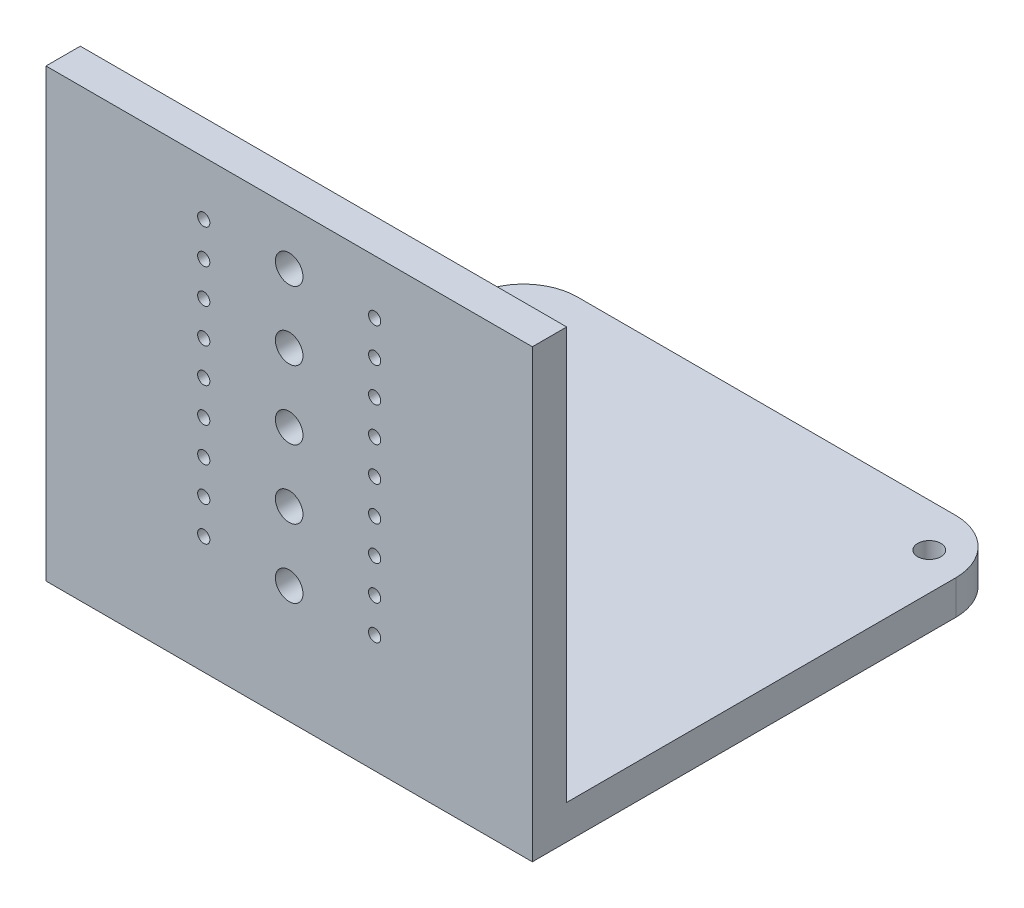
ISO-10303-21;
HEADER;
FILE_DESCRIPTION(('STEP AP214'),'2;1');
FILE_NAME('part.step','',(''),(''),'','','');
FILE_SCHEMA(('AUTOMOTIVE_DESIGN { 1 0 10303 214 1 1 1 1 }'));
ENDSEC;
DATA;
#1=APPLICATION_CONTEXT('core data for automotive mechanical design processes');
#2=APPLICATION_PROTOCOL_DEFINITION('international standard','automotive_design',2000,#1);
#3=PRODUCT_CONTEXT('',#1,'mechanical');
#4=PRODUCT('Part','Part','',(#3));
#5=PRODUCT_RELATED_PRODUCT_CATEGORY('part','',(#4));
#6=PRODUCT_DEFINITION_FORMATION('','',#4);
#7=PRODUCT_DEFINITION_CONTEXT('part definition',#1,'design');
#8=PRODUCT_DEFINITION('design','',#6,#7);
#9=PRODUCT_DEFINITION_SHAPE('','',#8);
#10=(LENGTH_UNIT() NAMED_UNIT(*) SI_UNIT(.MILLI.,.METRE.));
#11=(NAMED_UNIT(*) PLANE_ANGLE_UNIT() SI_UNIT($,.RADIAN.));
#12=(NAMED_UNIT(*) SI_UNIT($,.STERADIAN.) SOLID_ANGLE_UNIT());
#13=UNCERTAINTY_MEASURE_WITH_UNIT(LENGTH_MEASURE(1.E-05),#10,'distance_accuracy_value','');
#14=(GEOMETRIC_REPRESENTATION_CONTEXT(3) GLOBAL_UNCERTAINTY_ASSIGNED_CONTEXT((#13)) GLOBAL_UNIT_ASSIGNED_CONTEXT((#10,
#11,#12)) REPRESENTATION_CONTEXT('',''));
#15=CARTESIAN_POINT('',(0.,0.,0.));
#16=DIRECTION('',(0.,0.,1.));
#17=DIRECTION('',(1.,0.,0.));
#18=AXIS2_PLACEMENT_3D('',#15,#16,#17);
#19=CARTESIAN_POINT('',(45.,6.35,0.));
#20=DIRECTION('',(1.,0.,0.));
#21=DIRECTION('',(0.,0.,-1.));
#22=AXIS2_PLACEMENT_3D('',#19,#20,#21);
#23=PLANE('',#22);
#24=DIRECTION('',(0.,0.,1.));
#25=VECTOR('',#24,1.);
#26=CARTESIAN_POINT('',(45.,0.,0.));
#27=LINE('',#26,#25);
#28=CARTESIAN_POINT('',(45.,0.,-20.));
#29=VERTEX_POINT('',#28);
#30=CARTESIAN_POINT('',(45.,0.,58.35));
#31=VERTEX_POINT('',#30);
#32=EDGE_CURVE('E176',#29,#31,#27,.T.);
#33=ORIENTED_EDGE('',*,*,#32,.F.);
#34=DIRECTION('',(0.,-1.,0.));
#35=VECTOR('',#34,1.);
#36=CARTESIAN_POINT('',(45.,6.35,-20.));
#37=LINE('',#36,#35);
#38=CARTESIAN_POINT('',(45.,6.35,-20.));
#39=VERTEX_POINT('',#38);
#40=EDGE_CURVE('E70',#29,#39,#37,.F.);
#41=ORIENTED_EDGE('',*,*,#40,.T.);
#42=DIRECTION('',(0.,0.,1.));
#43=VECTOR('',#42,1.);
#44=CARTESIAN_POINT('',(45.,6.35,0.));
#45=LINE('',#44,#43);
#46=CARTESIAN_POINT('',(45.,6.35,52.));
#47=VERTEX_POINT('',#46);
#48=EDGE_CURVE('E160',#39,#47,#45,.T.);
#49=ORIENTED_EDGE('',*,*,#48,.T.);
#50=DIRECTION('',(0.,-1.,0.));
#51=VECTOR('',#50,1.);
#52=CARTESIAN_POINT('',(45.,82.55,52.));
#53=LINE('',#52,#51);
#54=CARTESIAN_POINT('',(45.,82.55,52.));
#55=VERTEX_POINT('',#54);
#56=EDGE_CURVE('E134',#55,#47,#53,.T.);
#57=ORIENTED_EDGE('',*,*,#56,.F.);
#58=DIRECTION('',(0.,0.,-1.));
#59=VECTOR('',#58,1.);
#60=CARTESIAN_POINT('',(45.,82.55,0.));
#61=LINE('',#60,#59);
#62=CARTESIAN_POINT('',(45.,82.55,58.35));
#63=VERTEX_POINT('',#62);
#64=EDGE_CURVE('E122',#63,#55,#61,.T.);
#65=ORIENTED_EDGE('',*,*,#64,.F.);
#66=DIRECTION('',(0.,-1.,0.));
#67=VECTOR('',#66,1.);
#68=CARTESIAN_POINT('',(45.,6.35,58.35));
#69=LINE('',#68,#67);
#70=EDGE_CURVE('E167',#63,#31,#69,.T.);
#71=ORIENTED_EDGE('',*,*,#70,.T.);
#72=EDGE_LOOP('',(#33,#41,#49,#57,#65,#71));
#73=FACE_BOUND('',#72,.T.);
#74=ADVANCED_FACE('F47',(#73),#23,.T.);
#75=CARTESIAN_POINT('',(0.,6.35,-30.));
#76=DIRECTION('',(0.,0.,-1.));
#77=DIRECTION('',(-1.,0.,0.));
#78=AXIS2_PLACEMENT_3D('',#75,#76,#77);
#79=PLANE('',#78);
#80=DIRECTION('',(1.,0.,0.));
#81=VECTOR('',#80,1.);
#82=CARTESIAN_POINT('',(0.,6.35,-30.));
#83=LINE('',#82,#81);
#84=CARTESIAN_POINT('',(-35.,6.35,-30.));
#85=VERTEX_POINT('',#84);
#86=CARTESIAN_POINT('',(35.,6.35,-30.));
#87=VERTEX_POINT('',#86);
#88=EDGE_CURVE('E162',#85,#87,#83,.T.);
#89=ORIENTED_EDGE('',*,*,#88,.T.);
#90=DIRECTION('',(0.,-1.,0.));
#91=VECTOR('',#90,1.);
#92=CARTESIAN_POINT('',(35.,6.35,-30.));
#93=LINE('',#92,#91);
#94=CARTESIAN_POINT('',(35.,0.,-30.));
#95=VERTEX_POINT('',#94);
#96=EDGE_CURVE('E227',#87,#95,#93,.T.);
#97=ORIENTED_EDGE('',*,*,#96,.T.);
#98=DIRECTION('',(1.,0.,0.));
#99=VECTOR('',#98,1.);
#100=CARTESIAN_POINT('',(0.,0.,-30.));
#101=LINE('',#100,#99);
#102=CARTESIAN_POINT('',(-35.,0.,-30.));
#103=VERTEX_POINT('',#102);
#104=EDGE_CURVE('E178',#103,#95,#101,.T.);
#105=ORIENTED_EDGE('',*,*,#104,.F.);
#106=DIRECTION('',(0.,-1.,0.));
#107=VECTOR('',#106,1.);
#108=CARTESIAN_POINT('',(-35.,6.35,-30.));
#109=LINE('',#108,#107);
#110=EDGE_CURVE('E188',#103,#85,#109,.F.);
#111=ORIENTED_EDGE('',*,*,#110,.T.);
#112=EDGE_LOOP('',(#89,#97,#105,#111));
#113=FACE_BOUND('',#112,.T.);
#114=ADVANCED_FACE('F241',(#113),#79,.T.);
#115=CARTESIAN_POINT('',(-45.,6.35,0.));
#116=DIRECTION('',(1.,0.,0.));
#117=DIRECTION('',(0.,0.,-1.));
#118=AXIS2_PLACEMENT_3D('',#115,#116,#117);
#119=PLANE('',#118);
#120=DIRECTION('',(0.,0.,1.));
#121=VECTOR('',#120,1.);
#122=CARTESIAN_POINT('',(-45.,6.35,0.));
#123=LINE('',#122,#121);
#124=CARTESIAN_POINT('',(-45.,6.35,-20.));
#125=VERTEX_POINT('',#124);
#126=CARTESIAN_POINT('',(-45.,6.35,52.));
#127=VERTEX_POINT('',#126);
#128=EDGE_CURVE('E165',#125,#127,#123,.T.);
#129=ORIENTED_EDGE('',*,*,#128,.F.);
#130=DIRECTION('',(0.,-1.,0.));
#131=VECTOR('',#130,1.);
#132=CARTESIAN_POINT('',(-45.,0.,-20.));
#133=LINE('',#132,#131);
#134=CARTESIAN_POINT('',(-45.,0.,-20.));
#135=VERTEX_POINT('',#134);
#136=EDGE_CURVE('E11',#125,#135,#133,.T.);
#137=ORIENTED_EDGE('',*,*,#136,.T.);
#138=DIRECTION('',(0.,0.,1.));
#139=VECTOR('',#138,1.);
#140=CARTESIAN_POINT('',(-45.,0.,0.));
#141=LINE('',#140,#139);
#142=CARTESIAN_POINT('',(-45.,0.,58.35));
#143=VERTEX_POINT('',#142);
#144=EDGE_CURVE('E181',#135,#143,#141,.T.);
#145=ORIENTED_EDGE('',*,*,#144,.T.);
#146=DIRECTION('',(0.,-1.,0.));
#147=VECTOR('',#146,1.);
#148=CARTESIAN_POINT('',(-45.,6.35,58.35));
#149=LINE('',#148,#147);
#150=CARTESIAN_POINT('',(-45.,82.55,58.35));
#151=VERTEX_POINT('',#150);
#152=EDGE_CURVE('E139',#151,#143,#149,.T.);
#153=ORIENTED_EDGE('',*,*,#152,.F.);
#154=DIRECTION('',(0.,0.,-1.));
#155=VECTOR('',#154,1.);
#156=CARTESIAN_POINT('',(-45.,82.55,0.));
#157=LINE('',#156,#155);
#158=CARTESIAN_POINT('',(-45.,82.55,52.));
#159=VERTEX_POINT('',#158);
#160=EDGE_CURVE('E119',#151,#159,#157,.T.);
#161=ORIENTED_EDGE('',*,*,#160,.T.);
#162=DIRECTION('',(0.,-1.,0.));
#163=VECTOR('',#162,1.);
#164=CARTESIAN_POINT('',(-45.,82.55,52.));
#165=LINE('',#164,#163);
#166=EDGE_CURVE('E129',#159,#127,#165,.T.);
#167=ORIENTED_EDGE('',*,*,#166,.T.);
#168=EDGE_LOOP('',(#129,#137,#145,#153,#161,#167));
#169=FACE_BOUND('',#168,.T.);
#170=ADVANCED_FACE('F137',(#169),#119,.F.);
#171=CARTESIAN_POINT('',(38.105117766515,6.35,-22.0000000000006));
#172=DIRECTION('',(0.,-1.,0.));
#173=DIRECTION('',(0.,0.,-1.));
#174=AXIS2_PLACEMENT_3D('',#171,#172,#173);
#175=CYLINDRICAL_SURFACE('',#174,2.14999999999997);
#176=CARTESIAN_POINT('',(38.105117766515,6.35,-22.0000000000006));
#177=DIRECTION('',(0.,1.,0.));
#178=DIRECTION('',(0.,0.,1.));
#179=AXIS2_PLACEMENT_3D('',#176,#177,#178);
#180=CIRCLE('',#179,2.14999999999997);
#181=CARTESIAN_POINT('',(38.105117766515,6.35,-19.8500000000006));
#182=VERTEX_POINT('',#181);
#183=EDGE_CURVE('E157',#182,#182,#180,.T.);
#184=ORIENTED_EDGE('',*,*,#183,.T.);
#185=EDGE_LOOP('',(#184));
#186=FACE_BOUND('',#185,.T.);
#187=CARTESIAN_POINT('',(38.105117766515,0.,-22.0000000000006));
#188=DIRECTION('',(0.,1.,0.));
#189=DIRECTION('',(0.,0.,1.));
#190=AXIS2_PLACEMENT_3D('',#187,#188,#189);
#191=CIRCLE('',#190,2.14999999999997);
#192=CARTESIAN_POINT('',(38.105117766515,0.,-19.8500000000006));
#193=VERTEX_POINT('',#192);
#194=EDGE_CURVE('E173',#193,#193,#191,.T.);
#195=ORIENTED_EDGE('',*,*,#194,.F.);
#196=EDGE_LOOP('',(#195));
#197=FACE_BOUND('',#196,.T.);
#198=ADVANCED_FACE('F266',(#186,#197),#175,.F.);
#199=CARTESIAN_POINT('',(-38.1051177665159,6.35,-21.999999999999));
#200=DIRECTION('',(0.,-1.,0.));
#201=DIRECTION('',(0.,0.,-1.));
#202=AXIS2_PLACEMENT_3D('',#199,#200,#201);
#203=CYLINDRICAL_SURFACE('',#202,2.14999999999996);
#204=CARTESIAN_POINT('',(-38.1051177665159,6.35,-21.999999999999));
#205=DIRECTION('',(0.,1.,0.));
#206=DIRECTION('',(0.,0.,1.));
#207=AXIS2_PLACEMENT_3D('',#204,#205,#206);
#208=CIRCLE('',#207,2.14999999999996);
#209=CARTESIAN_POINT('',(-38.1051177665159,6.35,-19.8499999999991));
#210=VERTEX_POINT('',#209);
#211=EDGE_CURVE('E153',#210,#210,#208,.T.);
#212=ORIENTED_EDGE('',*,*,#211,.T.);
#213=EDGE_LOOP('',(#212));
#214=FACE_BOUND('',#213,.T.);
#215=CARTESIAN_POINT('',(-38.1051177665159,0.,-21.999999999999));
#216=DIRECTION('',(0.,1.,0.));
#217=DIRECTION('',(0.,0.,1.));
#218=AXIS2_PLACEMENT_3D('',#215,#216,#217);
#219=CIRCLE('',#218,2.14999999999996);
#220=CARTESIAN_POINT('',(-38.1051177665159,0.,-19.8499999999991));
#221=VERTEX_POINT('',#220);
#222=EDGE_CURVE('E170',#221,#221,#219,.T.);
#223=ORIENTED_EDGE('',*,*,#222,.F.);
#224=EDGE_LOOP('',(#223));
#225=FACE_BOUND('',#224,.T.);
#226=ADVANCED_FACE('F269',(#214,#225),#203,.F.);
#227=CARTESIAN_POINT('',(0.,6.35,44.));
#228=DIRECTION('',(0.,-1.,0.));
#229=DIRECTION('',(0.,0.,-1.));
#230=AXIS2_PLACEMENT_3D('',#227,#228,#229);
#231=CYLINDRICAL_SURFACE('',#230,2.14999999999996);
#232=CARTESIAN_POINT('',(0.,6.35,44.));
#233=DIRECTION('',(0.,1.,0.));
#234=DIRECTION('',(0.,0.,1.));
#235=AXIS2_PLACEMENT_3D('',#232,#233,#234);
#236=CIRCLE('',#235,2.14999999999996);
#237=CARTESIAN_POINT('',(0.,6.35,46.15));
#238=VERTEX_POINT('',#237);
#239=EDGE_CURVE('E150',#238,#238,#236,.T.);
#240=ORIENTED_EDGE('',*,*,#239,.T.);
#241=EDGE_LOOP('',(#240));
#242=FACE_BOUND('',#241,.T.);
#243=CARTESIAN_POINT('',(0.,0.,44.));
#244=DIRECTION('',(0.,1.,0.));
#245=DIRECTION('',(0.,0.,1.));
#246=AXIS2_PLACEMENT_3D('',#243,#244,#245);
#247=CIRCLE('',#246,2.14999999999996);
#248=CARTESIAN_POINT('',(0.,0.,46.15));
#249=VERTEX_POINT('',#248);
#250=EDGE_CURVE('E148',#249,#249,#247,.T.);
#251=ORIENTED_EDGE('',*,*,#250,.F.);
#252=EDGE_LOOP('',(#251));
#253=FACE_BOUND('',#252,.T.);
#254=ADVANCED_FACE('F273',(#242,#253),#231,.F.);
#255=CARTESIAN_POINT('',(0.,6.35,58.35));
#256=DIRECTION('',(0.,0.,-1.));
#257=DIRECTION('',(-1.,0.,0.));
#258=AXIS2_PLACEMENT_3D('',#255,#256,#257);
#259=PLANE('',#258);
#260=CARTESIAN_POINT('',(-15.8114999999999,21.75,58.35));
#261=DIRECTION('',(0.,0.,1.));
#262=DIRECTION('',(1.,0.,0.));
#263=AXIS2_PLACEMENT_3D('',#260,#261,#262);
#264=CIRCLE('',#263,1.1303);
#265=CARTESIAN_POINT('',(-14.6811999999999,21.75,58.35));
#266=VERTEX_POINT('',#265);
#267=EDGE_CURVE('E225',#266,#266,#264,.T.);
#268=ORIENTED_EDGE('',*,*,#267,.F.);
#269=EDGE_LOOP('',(#268));
#270=FACE_BOUND('',#269,.T.);
#271=CARTESIAN_POINT('',(15.8114999999999,21.75,58.35));
#272=DIRECTION('',(0.,0.,1.));
#273=DIRECTION('',(1.,0.,0.));
#274=AXIS2_PLACEMENT_3D('',#271,#272,#273);
#275=CIRCLE('',#274,1.1303);
#276=CARTESIAN_POINT('',(16.9417999999999,21.75,58.35));
#277=VERTEX_POINT('',#276);
#278=EDGE_CURVE('E221',#277,#277,#275,.T.);
#279=ORIENTED_EDGE('',*,*,#278,.F.);
#280=EDGE_LOOP('',(#279));
#281=FACE_BOUND('',#280,.T.);
#282=CARTESIAN_POINT('',(-15.8114999999999,28.1,58.35));
#283=DIRECTION('',(0.,0.,1.));
#284=DIRECTION('',(1.,0.,0.));
#285=AXIS2_PLACEMENT_3D('',#282,#283,#284);
#286=CIRCLE('',#285,1.1303);
#287=CARTESIAN_POINT('',(-14.6811999999999,28.1,58.35));
#288=VERTEX_POINT('',#287);
#289=EDGE_CURVE('E220',#288,#288,#286,.T.);
#290=ORIENTED_EDGE('',*,*,#289,.F.);
#291=EDGE_LOOP('',(#290));
#292=FACE_BOUND('',#291,.T.);
#293=CARTESIAN_POINT('',(15.8114999999999,28.1,58.35));
#294=DIRECTION('',(0.,0.,1.));
#295=DIRECTION('',(1.,0.,0.));
#296=AXIS2_PLACEMENT_3D('',#293,#294,#295);
#297=CIRCLE('',#296,1.1303);
#298=CARTESIAN_POINT('',(16.9417999999999,28.1,58.35));
#299=VERTEX_POINT('',#298);
#300=EDGE_CURVE('E216',#299,#299,#297,.T.);
#301=ORIENTED_EDGE('',*,*,#300,.F.);
#302=EDGE_LOOP('',(#301));
#303=FACE_BOUND('',#302,.T.);
#304=CARTESIAN_POINT('',(-15.8114999999999,34.45,58.35));
#305=DIRECTION('',(0.,0.,1.));
#306=DIRECTION('',(1.,0.,0.));
#307=AXIS2_PLACEMENT_3D('',#304,#305,#306);
#308=CIRCLE('',#307,1.1303);
#309=CARTESIAN_POINT('',(-14.6811999999999,34.45,58.35));
#310=VERTEX_POINT('',#309);
#311=EDGE_CURVE('E212',#310,#310,#308,.T.);
#312=ORIENTED_EDGE('',*,*,#311,.F.);
#313=EDGE_LOOP('',(#312));
#314=FACE_BOUND('',#313,.T.);
#315=CARTESIAN_POINT('',(15.8114999999999,34.45,58.35));
#316=DIRECTION('',(0.,0.,1.));
#317=DIRECTION('',(1.,0.,0.));
#318=AXIS2_PLACEMENT_3D('',#315,#316,#317);
#319=CIRCLE('',#318,1.1303);
#320=CARTESIAN_POINT('',(16.9417999999999,34.45,58.35));
#321=VERTEX_POINT('',#320);
#322=EDGE_CURVE('E208',#321,#321,#319,.T.);
#323=ORIENTED_EDGE('',*,*,#322,.F.);
#324=EDGE_LOOP('',(#323));
#325=FACE_BOUND('',#324,.T.);
#326=CARTESIAN_POINT('',(-15.8114999999999,40.8,58.35));
#327=DIRECTION('',(0.,0.,1.));
#328=DIRECTION('',(1.,0.,0.));
#329=AXIS2_PLACEMENT_3D('',#326,#327,#328);
#330=CIRCLE('',#329,1.1303);
#331=CARTESIAN_POINT('',(-14.6811999999999,40.8,58.35));
#332=VERTEX_POINT('',#331);
#333=EDGE_CURVE('E207',#332,#332,#330,.T.);
#334=ORIENTED_EDGE('',*,*,#333,.F.);
#335=EDGE_LOOP('',(#334));
#336=FACE_BOUND('',#335,.T.);
#337=CARTESIAN_POINT('',(15.8114999999999,40.8,58.35));
#338=DIRECTION('',(0.,0.,1.));
#339=DIRECTION('',(1.,0.,0.));
#340=AXIS2_PLACEMENT_3D('',#337,#338,#339);
#341=CIRCLE('',#340,1.1303);
#342=CARTESIAN_POINT('',(16.9417999999999,40.8,58.35));
#343=VERTEX_POINT('',#342);
#344=EDGE_CURVE('E203',#343,#343,#341,.T.);
#345=ORIENTED_EDGE('',*,*,#344,.F.);
#346=EDGE_LOOP('',(#345));
#347=FACE_BOUND('',#346,.T.);
#348=CARTESIAN_POINT('',(-15.8114999999999,47.15,58.35));
#349=DIRECTION('',(0.,0.,1.));
#350=DIRECTION('',(1.,0.,0.));
#351=AXIS2_PLACEMENT_3D('',#348,#349,#350);
#352=CIRCLE('',#351,1.1303);
#353=CARTESIAN_POINT('',(-14.6811999999999,47.15,58.35));
#354=VERTEX_POINT('',#353);
#355=EDGE_CURVE('E202',#354,#354,#352,.T.);
#356=ORIENTED_EDGE('',*,*,#355,.F.);
#357=EDGE_LOOP('',(#356));
#358=FACE_BOUND('',#357,.T.);
#359=CARTESIAN_POINT('',(15.8114999999999,47.15,58.35));
#360=DIRECTION('',(0.,0.,1.));
#361=DIRECTION('',(1.,0.,0.));
#362=AXIS2_PLACEMENT_3D('',#359,#360,#361);
#363=CIRCLE('',#362,1.1303);
#364=CARTESIAN_POINT('',(16.9417999999999,47.15,58.35));
#365=VERTEX_POINT('',#364);
#366=EDGE_CURVE('E1071',#365,#365,#363,.T.);
#367=ORIENTED_EDGE('',*,*,#366,.F.);
#368=EDGE_LOOP('',(#367));
#369=FACE_BOUND('',#368,.T.);
#370=CARTESIAN_POINT('',(-15.8114999999999,53.5,58.35));
#371=DIRECTION('',(0.,0.,1.));
#372=DIRECTION('',(1.,0.,0.));
#373=AXIS2_PLACEMENT_3D('',#370,#371,#372);
#374=CIRCLE('',#373,1.1303);
#375=CARTESIAN_POINT('',(-14.6811999999999,53.5,58.35));
#376=VERTEX_POINT('',#375);
#377=EDGE_CURVE('E1067',#376,#376,#374,.T.);
#378=ORIENTED_EDGE('',*,*,#377,.F.);
#379=EDGE_LOOP('',(#378));
#380=FACE_BOUND('',#379,.T.);
#381=CARTESIAN_POINT('',(15.8114999999999,53.5,58.35));
#382=DIRECTION('',(0.,0.,1.));
#383=DIRECTION('',(1.,0.,0.));
#384=AXIS2_PLACEMENT_3D('',#381,#382,#383);
#385=CIRCLE('',#384,1.1303);
#386=CARTESIAN_POINT('',(16.9417999999999,53.5,58.35));
#387=VERTEX_POINT('',#386);
#388=EDGE_CURVE('E1063',#387,#387,#385,.T.);
#389=ORIENTED_EDGE('',*,*,#388,.F.);
#390=EDGE_LOOP('',(#389));
#391=FACE_BOUND('',#390,.T.);
#392=CARTESIAN_POINT('',(-15.8114999999999,59.85,58.35));
#393=DIRECTION('',(0.,0.,1.));
#394=DIRECTION('',(1.,0.,0.));
#395=AXIS2_PLACEMENT_3D('',#392,#393,#394);
#396=CIRCLE('',#395,1.1303);
#397=CARTESIAN_POINT('',(-14.6811999999999,59.85,58.35));
#398=VERTEX_POINT('',#397);
#399=EDGE_CURVE('E198',#398,#398,#396,.T.);
#400=ORIENTED_EDGE('',*,*,#399,.F.);
#401=EDGE_LOOP('',(#400));
#402=FACE_BOUND('',#401,.T.);
#403=CARTESIAN_POINT('',(15.8114999999999,59.85,58.35));
#404=DIRECTION('',(0.,0.,1.));
#405=DIRECTION('',(1.,0.,0.));
#406=AXIS2_PLACEMENT_3D('',#403,#404,#405);
#407=CIRCLE('',#406,1.1303);
#408=CARTESIAN_POINT('',(16.9417999999999,59.85,58.35));
#409=VERTEX_POINT('',#408);
#410=EDGE_CURVE('E197',#409,#409,#407,.T.);
#411=ORIENTED_EDGE('',*,*,#410,.F.);
#412=EDGE_LOOP('',(#411));
#413=FACE_BOUND('',#412,.T.);
#414=CARTESIAN_POINT('',(-15.8114999999999,66.2,58.35));
#415=DIRECTION('',(0.,0.,1.));
#416=DIRECTION('',(1.,0.,0.));
#417=AXIS2_PLACEMENT_3D('',#414,#415,#416);
#418=CIRCLE('',#417,1.1303);
#419=CARTESIAN_POINT('',(-14.6811999999999,66.2,58.35));
#420=VERTEX_POINT('',#419);
#421=EDGE_CURVE('E193',#420,#420,#418,.T.);
#422=ORIENTED_EDGE('',*,*,#421,.F.);
#423=EDGE_LOOP('',(#422));
#424=FACE_BOUND('',#423,.T.);
#425=CARTESIAN_POINT('',(15.8114999999999,66.2,58.35));
#426=DIRECTION('',(0.,0.,1.));
#427=DIRECTION('',(1.,0.,0.));
#428=AXIS2_PLACEMENT_3D('',#425,#426,#427);
#429=CIRCLE('',#428,1.1303);
#430=CARTESIAN_POINT('',(16.9417999999999,66.2,58.35));
#431=VERTEX_POINT('',#430);
#432=EDGE_CURVE('E192',#431,#431,#429,.T.);
#433=ORIENTED_EDGE('',*,*,#432,.F.);
#434=EDGE_LOOP('',(#433));
#435=FACE_BOUND('',#434,.T.);
#436=CARTESIAN_POINT('',(0.,21.75,58.35));
#437=DIRECTION('',(0.,0.,1.));
#438=DIRECTION('',(1.,0.,0.));
#439=AXIS2_PLACEMENT_3D('',#436,#437,#438);
#440=CIRCLE('',#439,2.5527);
#441=CARTESIAN_POINT('',(2.55270000000001,21.75,58.35));
#442=VERTEX_POINT('',#441);
#443=EDGE_CURVE('E1049',#442,#442,#440,.T.);
#444=ORIENTED_EDGE('',*,*,#443,.F.);
#445=EDGE_LOOP('',(#444));
#446=FACE_BOUND('',#445,.T.);
#447=CARTESIAN_POINT('',(0.,34.45,58.35));
#448=DIRECTION('',(0.,0.,1.));
#449=DIRECTION('',(1.,0.,0.));
#450=AXIS2_PLACEMENT_3D('',#447,#448,#449);
#451=CIRCLE('',#450,2.5527);
#452=CARTESIAN_POINT('',(2.55270000000001,34.45,58.35));
#453=VERTEX_POINT('',#452);
#454=EDGE_CURVE('E1045',#453,#453,#451,.T.);
#455=ORIENTED_EDGE('',*,*,#454,.F.);
#456=EDGE_LOOP('',(#455));
#457=FACE_BOUND('',#456,.T.);
#458=CARTESIAN_POINT('',(0.,47.15,58.35));
#459=DIRECTION('',(0.,0.,1.));
#460=DIRECTION('',(1.,0.,0.));
#461=AXIS2_PLACEMENT_3D('',#458,#459,#460);
#462=CIRCLE('',#461,2.5527);
#463=CARTESIAN_POINT('',(2.55270000000001,47.15,58.35));
#464=VERTEX_POINT('',#463);
#465=EDGE_CURVE('E1041',#464,#464,#462,.T.);
#466=ORIENTED_EDGE('',*,*,#465,.F.);
#467=EDGE_LOOP('',(#466));
#468=FACE_BOUND('',#467,.T.);
#469=CARTESIAN_POINT('',(0.,59.85,58.35));
#470=DIRECTION('',(0.,0.,1.));
#471=DIRECTION('',(1.,0.,0.));
#472=AXIS2_PLACEMENT_3D('',#469,#470,#471);
#473=CIRCLE('',#472,2.5527);
#474=CARTESIAN_POINT('',(2.55270000000001,59.85,58.35));
#475=VERTEX_POINT('',#474);
#476=EDGE_CURVE('E1037',#475,#475,#473,.T.);
#477=ORIENTED_EDGE('',*,*,#476,.F.);
#478=EDGE_LOOP('',(#477));
#479=FACE_BOUND('',#478,.T.);
#480=CARTESIAN_POINT('',(-15.8114999999999,72.55,58.35));
#481=DIRECTION('',(0.,0.,1.));
#482=DIRECTION('',(1.,0.,0.));
#483=AXIS2_PLACEMENT_3D('',#480,#481,#482);
#484=CIRCLE('',#483,1.1303);
#485=CARTESIAN_POINT('',(-14.6811999999999,72.55,58.35));
#486=VERTEX_POINT('',#485);
#487=EDGE_CURVE('E1033',#486,#486,#484,.T.);
#488=ORIENTED_EDGE('',*,*,#487,.F.);
#489=EDGE_LOOP('',(#488));
#490=FACE_BOUND('',#489,.T.);
#491=CARTESIAN_POINT('',(15.8114999999999,72.55,58.35));
#492=DIRECTION('',(0.,0.,1.));
#493=DIRECTION('',(1.,0.,0.));
#494=AXIS2_PLACEMENT_3D('',#491,#492,#493);
#495=CIRCLE('',#494,1.1303);
#496=CARTESIAN_POINT('',(16.9417999999999,72.55,58.35));
#497=VERTEX_POINT('',#496);
#498=EDGE_CURVE('E1027',#497,#497,#495,.T.);
#499=ORIENTED_EDGE('',*,*,#498,.F.);
#500=EDGE_LOOP('',(#499));
#501=FACE_BOUND('',#500,.T.);
#502=CARTESIAN_POINT('',(0.,72.55,58.35));
#503=DIRECTION('',(0.,0.,1.));
#504=DIRECTION('',(1.,0.,0.));
#505=AXIS2_PLACEMENT_3D('',#502,#503,#504);
#506=CIRCLE('',#505,2.5527);
#507=CARTESIAN_POINT('',(2.55270000000001,72.55,58.35));
#508=VERTEX_POINT('',#507);
#509=EDGE_CURVE('E1024',#508,#508,#506,.T.);
#510=ORIENTED_EDGE('',*,*,#509,.F.);
#511=EDGE_LOOP('',(#510));
#512=FACE_BOUND('',#511,.T.);
#513=DIRECTION('',(1.,0.,0.));
#514=VECTOR('',#513,1.);
#515=CARTESIAN_POINT('',(0.,0.,58.35));
#516=LINE('',#515,#514);
#517=EDGE_CURVE('E154',#143,#31,#516,.T.);
#518=ORIENTED_EDGE('',*,*,#517,.T.);
#519=ORIENTED_EDGE('',*,*,#70,.F.);
#520=DIRECTION('',(-1.,0.,0.));
#521=VECTOR('',#520,1.);
#522=CARTESIAN_POINT('',(0.,82.55,58.35));
#523=LINE('',#522,#521);
#524=EDGE_CURVE('E135',#63,#151,#523,.T.);
#525=ORIENTED_EDGE('',*,*,#524,.T.);
#526=ORIENTED_EDGE('',*,*,#152,.T.);
#527=EDGE_LOOP('',(#518,#519,#525,#526));
#528=FACE_BOUND('',#527,.T.);
#529=ADVANCED_FACE('F249',(#270,#281,#292,#303,#314,#325,#336,#347,#358,#369,#380,#391,#402,
#413,#424,#435,#446,#457,#468,#479,#490,#501,#512,#528),#259,.F.);
#530=CARTESIAN_POINT('',(0.,6.35,0.));
#531=DIRECTION('',(0.,1.,0.));
#532=DIRECTION('',(0.,0.,1.));
#533=AXIS2_PLACEMENT_3D('',#530,#531,#532);
#534=PLANE('',#533);
#535=ORIENTED_EDGE('',*,*,#48,.F.);
#536=CARTESIAN_POINT('',(35.,6.35,-20.));
#537=DIRECTION('',(0.,1.,0.));
#538=DIRECTION('',(0.,0.,1.));
#539=AXIS2_PLACEMENT_3D('',#536,#537,#538);
#540=CIRCLE('',#539,10.);
#541=EDGE_CURVE('E55',#39,#87,#540,.T.);
#542=ORIENTED_EDGE('',*,*,#541,.T.);
#543=ORIENTED_EDGE('',*,*,#88,.F.);
#544=CARTESIAN_POINT('',(-35.,6.35,-20.));
#545=DIRECTION('',(0.,1.,0.));
#546=DIRECTION('',(0.,0.,1.));
#547=AXIS2_PLACEMENT_3D('',#544,#545,#546);
#548=CIRCLE('',#547,10.);
#549=EDGE_CURVE('E62',#85,#125,#548,.T.);
#550=ORIENTED_EDGE('',*,*,#549,.T.);
#551=ORIENTED_EDGE('',*,*,#128,.T.);
#552=DIRECTION('',(-1.,0.,0.));
#553=VECTOR('',#552,1.);
#554=CARTESIAN_POINT('',(0.,6.35,52.));
#555=LINE('',#554,#553);
#556=EDGE_CURVE('E132',#47,#127,#555,.T.);
#557=ORIENTED_EDGE('',*,*,#556,.F.);
#558=EDGE_LOOP('',(#535,#542,#543,#550,#551,#557));
#559=FACE_BOUND('',#558,.T.);
#560=ORIENTED_EDGE('',*,*,#239,.F.);
#561=EDGE_LOOP('',(#560));
#562=FACE_BOUND('',#561,.T.);
#563=ORIENTED_EDGE('',*,*,#211,.F.);
#564=EDGE_LOOP('',(#563));
#565=FACE_BOUND('',#564,.T.);
#566=ORIENTED_EDGE('',*,*,#183,.F.);
#567=EDGE_LOOP('',(#566));
#568=FACE_BOUND('',#567,.T.);
#569=ADVANCED_FACE('F236',(#559,#562,#565,#568),#534,.T.);
#570=CARTESIAN_POINT('',(0.,0.,0.));
#571=DIRECTION('',(0.,1.,0.));
#572=DIRECTION('',(0.,0.,1.));
#573=AXIS2_PLACEMENT_3D('',#570,#571,#572);
#574=PLANE('',#573);
#575=ORIENTED_EDGE('',*,*,#250,.T.);
#576=EDGE_LOOP('',(#575));
#577=FACE_BOUND('',#576,.T.);
#578=ORIENTED_EDGE('',*,*,#222,.T.);
#579=EDGE_LOOP('',(#578));
#580=FACE_BOUND('',#579,.T.);
#581=ORIENTED_EDGE('',*,*,#194,.T.);
#582=EDGE_LOOP('',(#581));
#583=FACE_BOUND('',#582,.T.);
#584=ORIENTED_EDGE('',*,*,#104,.T.);
#585=CARTESIAN_POINT('',(35.,0.,-20.));
#586=DIRECTION('',(0.,1.,0.));
#587=DIRECTION('',(0.,0.,1.));
#588=AXIS2_PLACEMENT_3D('',#585,#586,#587);
#589=CIRCLE('',#588,10.);
#590=EDGE_CURVE('E232',#95,#29,#589,.F.);
#591=ORIENTED_EDGE('',*,*,#590,.T.);
#592=ORIENTED_EDGE('',*,*,#32,.T.);
#593=ORIENTED_EDGE('',*,*,#517,.F.);
#594=ORIENTED_EDGE('',*,*,#144,.F.);
#595=CARTESIAN_POINT('',(-35.,0.,-20.));
#596=DIRECTION('',(0.,1.,0.));
#597=DIRECTION('',(0.,0.,1.));
#598=AXIS2_PLACEMENT_3D('',#595,#596,#597);
#599=CIRCLE('',#598,10.);
#600=EDGE_CURVE('E230',#135,#103,#599,.F.);
#601=ORIENTED_EDGE('',*,*,#600,.T.);
#602=EDGE_LOOP('',(#584,#591,#592,#593,#594,#601));
#603=FACE_BOUND('',#602,.T.);
#604=ADVANCED_FACE('F246',(#577,#580,#583,#603),#574,.F.);
#605=CARTESIAN_POINT('',(0.,82.55,52.));
#606=DIRECTION('',(0.,0.,1.));
#607=DIRECTION('',(1.,0.,0.));
#608=AXIS2_PLACEMENT_3D('',#605,#606,#607);
#609=PLANE('',#608);
#610=CARTESIAN_POINT('',(-15.8114999999999,21.75,52.));
#611=DIRECTION('',(0.,0.,1.));
#612=DIRECTION('',(1.,0.,0.));
#613=AXIS2_PLACEMENT_3D('',#610,#611,#612);
#614=CIRCLE('',#613,1.13029999999999);
#615=CARTESIAN_POINT('',(-14.6811999999999,21.75,52.));
#616=VERTEX_POINT('',#615);
#617=EDGE_CURVE('E222',#616,#616,#614,.T.);
#618=ORIENTED_EDGE('',*,*,#617,.T.);
#619=EDGE_LOOP('',(#618));
#620=FACE_BOUND('',#619,.T.);
#621=CARTESIAN_POINT('',(15.8114999999999,21.75,52.));
#622=DIRECTION('',(0.,0.,1.));
#623=DIRECTION('',(1.,0.,0.));
#624=AXIS2_PLACEMENT_3D('',#621,#622,#623);
#625=CIRCLE('',#624,1.13029999999999);
#626=CARTESIAN_POINT('',(16.9417999999999,21.75,52.));
#627=VERTEX_POINT('',#626);
#628=EDGE_CURVE('E217',#627,#627,#625,.T.);
#629=ORIENTED_EDGE('',*,*,#628,.T.);
#630=EDGE_LOOP('',(#629));
#631=FACE_BOUND('',#630,.T.);
#632=CARTESIAN_POINT('',(-15.8114999999999,28.1,52.));
#633=DIRECTION('',(0.,0.,1.));
#634=DIRECTION('',(1.,0.,0.));
#635=AXIS2_PLACEMENT_3D('',#632,#633,#634);
#636=CIRCLE('',#635,1.13029999999999);
#637=CARTESIAN_POINT('',(-14.6811999999999,28.1,52.));
#638=VERTEX_POINT('',#637);
#639=EDGE_CURVE('E956',#638,#638,#636,.T.);
#640=ORIENTED_EDGE('',*,*,#639,.T.);
#641=EDGE_LOOP('',(#640));
#642=FACE_BOUND('',#641,.T.);
#643=CARTESIAN_POINT('',(15.8114999999999,28.1,52.));
#644=DIRECTION('',(0.,0.,1.));
#645=DIRECTION('',(1.,0.,0.));
#646=AXIS2_PLACEMENT_3D('',#643,#644,#645);
#647=CIRCLE('',#646,1.13029999999999);
#648=CARTESIAN_POINT('',(16.9417999999999,28.1,52.));
#649=VERTEX_POINT('',#648);
#650=EDGE_CURVE('E213',#649,#649,#647,.T.);
#651=ORIENTED_EDGE('',*,*,#650,.T.);
#652=EDGE_LOOP('',(#651));
#653=FACE_BOUND('',#652,.T.);
#654=CARTESIAN_POINT('',(-15.8114999999999,34.45,52.));
#655=DIRECTION('',(0.,0.,1.));
#656=DIRECTION('',(1.,0.,0.));
#657=AXIS2_PLACEMENT_3D('',#654,#655,#656);
#658=CIRCLE('',#657,1.13029999999999);
#659=CARTESIAN_POINT('',(-14.6811999999999,34.45,52.));
#660=VERTEX_POINT('',#659);
#661=EDGE_CURVE('E209',#660,#660,#658,.T.);
#662=ORIENTED_EDGE('',*,*,#661,.T.);
#663=EDGE_LOOP('',(#662));
#664=FACE_BOUND('',#663,.T.);
#665=CARTESIAN_POINT('',(15.8114999999999,34.45,52.));
#666=DIRECTION('',(0.,0.,1.));
#667=DIRECTION('',(1.,0.,0.));
#668=AXIS2_PLACEMENT_3D('',#665,#666,#667);
#669=CIRCLE('',#668,1.13029999999999);
#670=CARTESIAN_POINT('',(16.9417999999999,34.45,52.));
#671=VERTEX_POINT('',#670);
#672=EDGE_CURVE('E204',#671,#671,#669,.T.);
#673=ORIENTED_EDGE('',*,*,#672,.T.);
#674=EDGE_LOOP('',(#673));
#675=FACE_BOUND('',#674,.T.);
#676=CARTESIAN_POINT('',(-15.8114999999999,40.8,52.));
#677=DIRECTION('',(0.,0.,1.));
#678=DIRECTION('',(1.,0.,0.));
#679=AXIS2_PLACEMENT_3D('',#676,#677,#678);
#680=CIRCLE('',#679,1.13029999999999);
#681=CARTESIAN_POINT('',(-14.6811999999999,40.8,52.));
#682=VERTEX_POINT('',#681);
#683=EDGE_CURVE('E966',#682,#682,#680,.T.);
#684=ORIENTED_EDGE('',*,*,#683,.T.);
#685=EDGE_LOOP('',(#684));
#686=FACE_BOUND('',#685,.T.);
#687=CARTESIAN_POINT('',(15.8114999999999,40.8,52.));
#688=DIRECTION('',(0.,0.,1.));
#689=DIRECTION('',(1.,0.,0.));
#690=AXIS2_PLACEMENT_3D('',#687,#688,#689);
#691=CIRCLE('',#690,1.13029999999999);
#692=CARTESIAN_POINT('',(16.9417999999999,40.8,52.));
#693=VERTEX_POINT('',#692);
#694=EDGE_CURVE('E199',#693,#693,#691,.T.);
#695=ORIENTED_EDGE('',*,*,#694,.T.);
#696=EDGE_LOOP('',(#695));
#697=FACE_BOUND('',#696,.T.);
#698=CARTESIAN_POINT('',(-15.8114999999999,47.15,52.));
#699=DIRECTION('',(0.,0.,1.));
#700=DIRECTION('',(1.,0.,0.));
#701=AXIS2_PLACEMENT_3D('',#698,#699,#700);
#702=CIRCLE('',#701,1.13029999999999);
#703=CARTESIAN_POINT('',(-14.6811999999999,47.15,52.));
#704=VERTEX_POINT('',#703);
#705=EDGE_CURVE('E972',#704,#704,#702,.T.);
#706=ORIENTED_EDGE('',*,*,#705,.T.);
#707=EDGE_LOOP('',(#706));
#708=FACE_BOUND('',#707,.T.);
#709=CARTESIAN_POINT('',(15.8114999999999,47.15,52.));
#710=DIRECTION('',(0.,0.,1.));
#711=DIRECTION('',(1.,0.,0.));
#712=AXIS2_PLACEMENT_3D('',#709,#710,#711);
#713=CIRCLE('',#712,1.13029999999999);
#714=CARTESIAN_POINT('',(16.9417999999999,47.15,52.));
#715=VERTEX_POINT('',#714);
#716=EDGE_CURVE('E976',#715,#715,#713,.T.);
#717=ORIENTED_EDGE('',*,*,#716,.T.);
#718=EDGE_LOOP('',(#717));
#719=FACE_BOUND('',#718,.T.);
#720=CARTESIAN_POINT('',(-15.8114999999999,53.5,52.));
#721=DIRECTION('',(0.,0.,1.));
#722=DIRECTION('',(1.,0.,0.));
#723=AXIS2_PLACEMENT_3D('',#720,#721,#722);
#724=CIRCLE('',#723,1.13029999999999);
#725=CARTESIAN_POINT('',(-14.6811999999999,53.5,52.));
#726=VERTEX_POINT('',#725);
#727=EDGE_CURVE('E980',#726,#726,#724,.T.);
#728=ORIENTED_EDGE('',*,*,#727,.T.);
#729=EDGE_LOOP('',(#728));
#730=FACE_BOUND('',#729,.T.);
#731=CARTESIAN_POINT('',(15.8114999999999,53.5,52.));
#732=DIRECTION('',(0.,0.,1.));
#733=DIRECTION('',(1.,0.,0.));
#734=AXIS2_PLACEMENT_3D('',#731,#732,#733);
#735=CIRCLE('',#734,1.13029999999999);
#736=CARTESIAN_POINT('',(16.9417999999999,53.5,52.));
#737=VERTEX_POINT('',#736);
#738=EDGE_CURVE('E984',#737,#737,#735,.T.);
#739=ORIENTED_EDGE('',*,*,#738,.T.);
#740=EDGE_LOOP('',(#739));
#741=FACE_BOUND('',#740,.T.);
#742=CARTESIAN_POINT('',(-15.8114999999999,59.85,52.));
#743=DIRECTION('',(0.,0.,1.));
#744=DIRECTION('',(1.,0.,0.));
#745=AXIS2_PLACEMENT_3D('',#742,#743,#744);
#746=CIRCLE('',#745,1.13029999999999);
#747=CARTESIAN_POINT('',(-14.6811999999999,59.85,52.));
#748=VERTEX_POINT('',#747);
#749=EDGE_CURVE('E194',#748,#748,#746,.T.);
#750=ORIENTED_EDGE('',*,*,#749,.T.);
#751=EDGE_LOOP('',(#750));
#752=FACE_BOUND('',#751,.T.);
#753=CARTESIAN_POINT('',(15.8114999999999,59.85,52.));
#754=DIRECTION('',(0.,0.,1.));
#755=DIRECTION('',(1.,0.,0.));
#756=AXIS2_PLACEMENT_3D('',#753,#754,#755);
#757=CIRCLE('',#756,1.13029999999999);
#758=CARTESIAN_POINT('',(16.9417999999999,59.85,52.));
#759=VERTEX_POINT('',#758);
#760=EDGE_CURVE('E990',#759,#759,#757,.T.);
#761=ORIENTED_EDGE('',*,*,#760,.T.);
#762=EDGE_LOOP('',(#761));
#763=FACE_BOUND('',#762,.T.);
#764=CARTESIAN_POINT('',(-15.8114999999999,66.2,52.));
#765=DIRECTION('',(0.,0.,1.));
#766=DIRECTION('',(1.,0.,0.));
#767=AXIS2_PLACEMENT_3D('',#764,#765,#766);
#768=CIRCLE('',#767,1.13029999999999);
#769=CARTESIAN_POINT('',(-14.6811999999999,66.2,52.));
#770=VERTEX_POINT('',#769);
#771=EDGE_CURVE('E189',#770,#770,#768,.T.);
#772=ORIENTED_EDGE('',*,*,#771,.T.);
#773=EDGE_LOOP('',(#772));
#774=FACE_BOUND('',#773,.T.);
#775=CARTESIAN_POINT('',(15.8114999999999,66.2,52.));
#776=DIRECTION('',(0.,0.,1.));
#777=DIRECTION('',(1.,0.,0.));
#778=AXIS2_PLACEMENT_3D('',#775,#776,#777);
#779=CIRCLE('',#778,1.13029999999999);
#780=CARTESIAN_POINT('',(16.9417999999999,66.2,52.));
#781=VERTEX_POINT('',#780);
#782=EDGE_CURVE('E996',#781,#781,#779,.T.);
#783=ORIENTED_EDGE('',*,*,#782,.T.);
#784=EDGE_LOOP('',(#783));
#785=FACE_BOUND('',#784,.T.);
#786=CARTESIAN_POINT('',(0.,21.75,52.));
#787=DIRECTION('',(0.,0.,1.));
#788=DIRECTION('',(1.,0.,0.));
#789=AXIS2_PLACEMENT_3D('',#786,#787,#788);
#790=CIRCLE('',#789,2.55269999999999);
#791=CARTESIAN_POINT('',(2.5527,21.75,52.));
#792=VERTEX_POINT('',#791);
#793=EDGE_CURVE('E1000',#792,#792,#790,.T.);
#794=ORIENTED_EDGE('',*,*,#793,.T.);
#795=EDGE_LOOP('',(#794));
#796=FACE_BOUND('',#795,.T.);
#797=CARTESIAN_POINT('',(0.,34.45,52.));
#798=DIRECTION('',(0.,0.,1.));
#799=DIRECTION('',(1.,0.,0.));
#800=AXIS2_PLACEMENT_3D('',#797,#798,#799);
#801=CIRCLE('',#800,2.55269999999999);
#802=CARTESIAN_POINT('',(2.5527,34.45,52.));
#803=VERTEX_POINT('',#802);
#804=EDGE_CURVE('E1004',#803,#803,#801,.T.);
#805=ORIENTED_EDGE('',*,*,#804,.T.);
#806=EDGE_LOOP('',(#805));
#807=FACE_BOUND('',#806,.T.);
#808=CARTESIAN_POINT('',(0.,47.15,52.));
#809=DIRECTION('',(0.,0.,1.));
#810=DIRECTION('',(1.,0.,0.));
#811=AXIS2_PLACEMENT_3D('',#808,#809,#810);
#812=CIRCLE('',#811,2.55269999999999);
#813=CARTESIAN_POINT('',(2.5527,47.15,52.));
#814=VERTEX_POINT('',#813);
#815=EDGE_CURVE('E1008',#814,#814,#812,.T.);
#816=ORIENTED_EDGE('',*,*,#815,.T.);
#817=EDGE_LOOP('',(#816));
#818=FACE_BOUND('',#817,.T.);
#819=CARTESIAN_POINT('',(0.,59.85,52.));
#820=DIRECTION('',(0.,0.,1.));
#821=DIRECTION('',(1.,0.,0.));
#822=AXIS2_PLACEMENT_3D('',#819,#820,#821);
#823=CIRCLE('',#822,2.55269999999999);
#824=CARTESIAN_POINT('',(2.5527,59.85,52.));
#825=VERTEX_POINT('',#824);
#826=EDGE_CURVE('E1012',#825,#825,#823,.T.);
#827=ORIENTED_EDGE('',*,*,#826,.T.);
#828=EDGE_LOOP('',(#827));
#829=FACE_BOUND('',#828,.T.);
#830=CARTESIAN_POINT('',(-15.8114999999999,72.55,52.));
#831=DIRECTION('',(0.,0.,1.));
#832=DIRECTION('',(1.,0.,0.));
#833=AXIS2_PLACEMENT_3D('',#830,#831,#832);
#834=CIRCLE('',#833,1.13029999999999);
#835=CARTESIAN_POINT('',(-14.6811999999999,72.55,52.));
#836=VERTEX_POINT('',#835);
#837=EDGE_CURVE('E1016',#836,#836,#834,.T.);
#838=ORIENTED_EDGE('',*,*,#837,.T.);
#839=EDGE_LOOP('',(#838));
#840=FACE_BOUND('',#839,.T.);
#841=CARTESIAN_POINT('',(15.8114999999999,72.55,52.));
#842=DIRECTION('',(0.,0.,1.));
#843=DIRECTION('',(1.,0.,0.));
#844=AXIS2_PLACEMENT_3D('',#841,#842,#843);
#845=CIRCLE('',#844,1.13029999999999);
#846=CARTESIAN_POINT('',(16.9417999999999,72.55,52.));
#847=VERTEX_POINT('',#846);
#848=EDGE_CURVE('E1020',#847,#847,#845,.T.);
#849=ORIENTED_EDGE('',*,*,#848,.T.);
#850=EDGE_LOOP('',(#849));
#851=FACE_BOUND('',#850,.T.);
#852=CARTESIAN_POINT('',(0.,72.55,52.));
#853=DIRECTION('',(0.,0.,1.));
#854=DIRECTION('',(1.,0.,0.));
#855=AXIS2_PLACEMENT_3D('',#852,#853,#854);
#856=CIRCLE('',#855,2.55269999999999);
#857=CARTESIAN_POINT('',(2.5527,72.55,52.));
#858=VERTEX_POINT('',#857);
#859=EDGE_CURVE('E141',#858,#858,#856,.T.);
#860=ORIENTED_EDGE('',*,*,#859,.T.);
#861=EDGE_LOOP('',(#860));
#862=FACE_BOUND('',#861,.T.);
#863=ORIENTED_EDGE('',*,*,#556,.T.);
#864=ORIENTED_EDGE('',*,*,#166,.F.);
#865=DIRECTION('',(-1.,0.,0.));
#866=VECTOR('',#865,1.);
#867=CARTESIAN_POINT('',(0.,82.55,52.));
#868=LINE('',#867,#866);
#869=EDGE_CURVE('E114',#55,#159,#868,.T.);
#870=ORIENTED_EDGE('',*,*,#869,.F.);
#871=ORIENTED_EDGE('',*,*,#56,.T.);
#872=EDGE_LOOP('',(#863,#864,#870,#871));
#873=FACE_BOUND('',#872,.T.);
#874=ADVANCED_FACE('F130',(#620,#631,#642,#653,#664,#675,#686,#697,#708,#719,#730,#741,#752,
#763,#774,#785,#796,#807,#818,#829,#840,#851,#862,#873),#609,.F.);
#875=CARTESIAN_POINT('',(0.,82.55,0.));
#876=DIRECTION('',(0.,1.,0.));
#877=DIRECTION('',(0.,0.,1.));
#878=AXIS2_PLACEMENT_3D('',#875,#876,#877);
#879=PLANE('',#878);
#880=ORIENTED_EDGE('',*,*,#160,.F.);
#881=ORIENTED_EDGE('',*,*,#524,.F.);
#882=ORIENTED_EDGE('',*,*,#64,.T.);
#883=ORIENTED_EDGE('',*,*,#869,.T.);
#884=EDGE_LOOP('',(#880,#881,#882,#883));
#885=FACE_BOUND('',#884,.T.);
#886=ADVANCED_FACE('F116',(#885),#879,.T.);
#887=CARTESIAN_POINT('',(0.,72.55,58.35));
#888=DIRECTION('',(0.,0.,1.));
#889=DIRECTION('',(1.,0.,0.));
#890=AXIS2_PLACEMENT_3D('',#887,#888,#889);
#891=CYLINDRICAL_SURFACE('',#890,2.55269999999999);
#892=ORIENTED_EDGE('',*,*,#509,.T.);
#893=EDGE_LOOP('',(#892));
#894=FACE_BOUND('',#893,.T.);
#895=ORIENTED_EDGE('',*,*,#859,.F.);
#896=EDGE_LOOP('',(#895));
#897=FACE_BOUND('',#896,.T.);
#898=ADVANCED_FACE('F354',(#894,#897),#891,.F.);
#899=CARTESIAN_POINT('',(15.8114999999999,72.55,58.35));
#900=DIRECTION('',(0.,0.,1.));
#901=DIRECTION('',(1.,0.,0.));
#902=AXIS2_PLACEMENT_3D('',#899,#900,#901);
#903=CYLINDRICAL_SURFACE('',#902,1.13029999999999);
#904=ORIENTED_EDGE('',*,*,#498,.T.);
#905=EDGE_LOOP('',(#904));
#906=FACE_BOUND('',#905,.T.);
#907=ORIENTED_EDGE('',*,*,#848,.F.);
#908=EDGE_LOOP('',(#907));
#909=FACE_BOUND('',#908,.T.);
#910=ADVANCED_FACE('F364',(#906,#909),#903,.F.);
#911=CARTESIAN_POINT('',(-15.8114999999999,72.55,58.35));
#912=DIRECTION('',(0.,0.,1.));
#913=DIRECTION('',(1.,0.,0.));
#914=AXIS2_PLACEMENT_3D('',#911,#912,#913);
#915=CYLINDRICAL_SURFACE('',#914,1.13029999999999);
#916=ORIENTED_EDGE('',*,*,#487,.T.);
#917=EDGE_LOOP('',(#916));
#918=FACE_BOUND('',#917,.T.);
#919=ORIENTED_EDGE('',*,*,#837,.F.);
#920=EDGE_LOOP('',(#919));
#921=FACE_BOUND('',#920,.T.);
#922=ADVANCED_FACE('F376',(#918,#921),#915,.F.);
#923=CARTESIAN_POINT('',(0.,59.85,58.35));
#924=DIRECTION('',(0.,0.,1.));
#925=DIRECTION('',(1.,0.,0.));
#926=AXIS2_PLACEMENT_3D('',#923,#924,#925);
#927=CYLINDRICAL_SURFACE('',#926,2.55269999999999);
#928=ORIENTED_EDGE('',*,*,#476,.T.);
#929=EDGE_LOOP('',(#928));
#930=FACE_BOUND('',#929,.T.);
#931=ORIENTED_EDGE('',*,*,#826,.F.);
#932=EDGE_LOOP('',(#931));
#933=FACE_BOUND('',#932,.T.);
#934=ADVANCED_FACE('F386',(#930,#933),#927,.F.);
#935=CARTESIAN_POINT('',(0.,47.15,58.35));
#936=DIRECTION('',(0.,0.,1.));
#937=DIRECTION('',(1.,0.,0.));
#938=AXIS2_PLACEMENT_3D('',#935,#936,#937);
#939=CYLINDRICAL_SURFACE('',#938,2.55269999999999);
#940=ORIENTED_EDGE('',*,*,#465,.T.);
#941=EDGE_LOOP('',(#940));
#942=FACE_BOUND('',#941,.T.);
#943=ORIENTED_EDGE('',*,*,#815,.F.);
#944=EDGE_LOOP('',(#943));
#945=FACE_BOUND('',#944,.T.);
#946=ADVANCED_FACE('F397',(#942,#945),#939,.F.);
#947=CARTESIAN_POINT('',(0.,34.45,58.35));
#948=DIRECTION('',(0.,0.,1.));
#949=DIRECTION('',(1.,0.,0.));
#950=AXIS2_PLACEMENT_3D('',#947,#948,#949);
#951=CYLINDRICAL_SURFACE('',#950,2.55269999999999);
#952=ORIENTED_EDGE('',*,*,#454,.T.);
#953=EDGE_LOOP('',(#952));
#954=FACE_BOUND('',#953,.T.);
#955=ORIENTED_EDGE('',*,*,#804,.F.);
#956=EDGE_LOOP('',(#955));
#957=FACE_BOUND('',#956,.T.);
#958=ADVANCED_FACE('F409',(#954,#957),#951,.F.);
#959=CARTESIAN_POINT('',(0.,21.75,58.35));
#960=DIRECTION('',(0.,0.,1.));
#961=DIRECTION('',(1.,0.,0.));
#962=AXIS2_PLACEMENT_3D('',#959,#960,#961);
#963=CYLINDRICAL_SURFACE('',#962,2.55269999999999);
#964=ORIENTED_EDGE('',*,*,#443,.T.);
#965=EDGE_LOOP('',(#964));
#966=FACE_BOUND('',#965,.T.);
#967=ORIENTED_EDGE('',*,*,#793,.F.);
#968=EDGE_LOOP('',(#967));
#969=FACE_BOUND('',#968,.T.);
#970=ADVANCED_FACE('F420',(#966,#969),#963,.F.);
#971=CARTESIAN_POINT('',(15.8114999999999,66.2,58.35));
#972=DIRECTION('',(0.,0.,1.));
#973=DIRECTION('',(1.,0.,0.));
#974=AXIS2_PLACEMENT_3D('',#971,#972,#973);
#975=CYLINDRICAL_SURFACE('',#974,1.13029999999999);
#976=ORIENTED_EDGE('',*,*,#432,.T.);
#977=EDGE_LOOP('',(#976));
#978=FACE_BOUND('',#977,.T.);
#979=ORIENTED_EDGE('',*,*,#782,.F.);
#980=EDGE_LOOP('',(#979));
#981=FACE_BOUND('',#980,.T.);
#982=ADVANCED_FACE('F429',(#978,#981),#975,.F.);
#983=CARTESIAN_POINT('',(-15.8114999999999,66.2,58.35));
#984=DIRECTION('',(0.,0.,1.));
#985=DIRECTION('',(1.,0.,0.));
#986=AXIS2_PLACEMENT_3D('',#983,#984,#985);
#987=CYLINDRICAL_SURFACE('',#986,1.13029999999999);
#988=ORIENTED_EDGE('',*,*,#421,.T.);
#989=EDGE_LOOP('',(#988));
#990=FACE_BOUND('',#989,.T.);
#991=ORIENTED_EDGE('',*,*,#771,.F.);
#992=EDGE_LOOP('',(#991));
#993=FACE_BOUND('',#992,.T.);
#994=ADVANCED_FACE('F438',(#990,#993),#987,.F.);
#995=CARTESIAN_POINT('',(15.8114999999999,59.85,58.35));
#996=DIRECTION('',(0.,0.,1.));
#997=DIRECTION('',(1.,0.,0.));
#998=AXIS2_PLACEMENT_3D('',#995,#996,#997);
#999=CYLINDRICAL_SURFACE('',#998,1.13029999999999);
#1000=ORIENTED_EDGE('',*,*,#410,.T.);
#1001=EDGE_LOOP('',(#1000));
#1002=FACE_BOUND('',#1001,.T.);
#1003=ORIENTED_EDGE('',*,*,#760,.F.);
#1004=EDGE_LOOP('',(#1003));
#1005=FACE_BOUND('',#1004,.T.);
#1006=ADVANCED_FACE('F448',(#1002,#1005),#999,.F.);
#1007=CARTESIAN_POINT('',(-15.8114999999999,59.85,58.35));
#1008=DIRECTION('',(0.,0.,1.));
#1009=DIRECTION('',(1.,0.,0.));
#1010=AXIS2_PLACEMENT_3D('',#1007,#1008,#1009);
#1011=CYLINDRICAL_SURFACE('',#1010,1.13029999999999);
#1012=ORIENTED_EDGE('',*,*,#399,.T.);
#1013=EDGE_LOOP('',(#1012));
#1014=FACE_BOUND('',#1013,.T.);
#1015=ORIENTED_EDGE('',*,*,#749,.F.);
#1016=EDGE_LOOP('',(#1015));
#1017=FACE_BOUND('',#1016,.T.);
#1018=ADVANCED_FACE('F459',(#1014,#1017),#1011,.F.);
#1019=CARTESIAN_POINT('',(15.8114999999999,53.5,58.35));
#1020=DIRECTION('',(0.,0.,1.));
#1021=DIRECTION('',(1.,0.,0.));
#1022=AXIS2_PLACEMENT_3D('',#1019,#1020,#1021);
#1023=CYLINDRICAL_SURFACE('',#1022,1.13029999999999);
#1024=ORIENTED_EDGE('',*,*,#388,.T.);
#1025=EDGE_LOOP('',(#1024));
#1026=FACE_BOUND('',#1025,.T.);
#1027=ORIENTED_EDGE('',*,*,#738,.F.);
#1028=EDGE_LOOP('',(#1027));
#1029=FACE_BOUND('',#1028,.T.);
#1030=ADVANCED_FACE('F470',(#1026,#1029),#1023,.F.);
#1031=CARTESIAN_POINT('',(-15.8114999999999,53.5,58.35));
#1032=DIRECTION('',(0.,0.,1.));
#1033=DIRECTION('',(1.,0.,0.));
#1034=AXIS2_PLACEMENT_3D('',#1031,#1032,#1033);
#1035=CYLINDRICAL_SURFACE('',#1034,1.13029999999999);
#1036=ORIENTED_EDGE('',*,*,#377,.T.);
#1037=EDGE_LOOP('',(#1036));
#1038=FACE_BOUND('',#1037,.T.);
#1039=ORIENTED_EDGE('',*,*,#727,.F.);
#1040=EDGE_LOOP('',(#1039));
#1041=FACE_BOUND('',#1040,.T.);
#1042=ADVANCED_FACE('F480',(#1038,#1041),#1035,.F.);
#1043=CARTESIAN_POINT('',(15.8114999999999,47.15,58.35));
#1044=DIRECTION('',(0.,0.,1.));
#1045=DIRECTION('',(1.,0.,0.));
#1046=AXIS2_PLACEMENT_3D('',#1043,#1044,#1045);
#1047=CYLINDRICAL_SURFACE('',#1046,1.13029999999999);
#1048=ORIENTED_EDGE('',*,*,#366,.T.);
#1049=EDGE_LOOP('',(#1048));
#1050=FACE_BOUND('',#1049,.T.);
#1051=ORIENTED_EDGE('',*,*,#716,.F.);
#1052=EDGE_LOOP('',(#1051));
#1053=FACE_BOUND('',#1052,.T.);
#1054=ADVANCED_FACE('F491',(#1050,#1053),#1047,.F.);
#1055=CARTESIAN_POINT('',(-15.8114999999999,47.15,58.35));
#1056=DIRECTION('',(0.,0.,1.));
#1057=DIRECTION('',(1.,0.,0.));
#1058=AXIS2_PLACEMENT_3D('',#1055,#1056,#1057);
#1059=CYLINDRICAL_SURFACE('',#1058,1.13029999999999);
#1060=ORIENTED_EDGE('',*,*,#355,.T.);
#1061=EDGE_LOOP('',(#1060));
#1062=FACE_BOUND('',#1061,.T.);
#1063=ORIENTED_EDGE('',*,*,#705,.F.);
#1064=EDGE_LOOP('',(#1063));
#1065=FACE_BOUND('',#1064,.T.);
#1066=ADVANCED_FACE('F501',(#1062,#1065),#1059,.F.);
#1067=CARTESIAN_POINT('',(15.8114999999999,40.8,58.35));
#1068=DIRECTION('',(0.,0.,1.));
#1069=DIRECTION('',(1.,0.,0.));
#1070=AXIS2_PLACEMENT_3D('',#1067,#1068,#1069);
#1071=CYLINDRICAL_SURFACE('',#1070,1.13029999999999);
#1072=ORIENTED_EDGE('',*,*,#344,.T.);
#1073=EDGE_LOOP('',(#1072));
#1074=FACE_BOUND('',#1073,.T.);
#1075=ORIENTED_EDGE('',*,*,#694,.F.);
#1076=EDGE_LOOP('',(#1075));
#1077=FACE_BOUND('',#1076,.T.);
#1078=ADVANCED_FACE('F510',(#1074,#1077),#1071,.F.);
#1079=CARTESIAN_POINT('',(-15.8114999999999,40.8,58.35));
#1080=DIRECTION('',(0.,0.,1.));
#1081=DIRECTION('',(1.,0.,0.));
#1082=AXIS2_PLACEMENT_3D('',#1079,#1080,#1081);
#1083=CYLINDRICAL_SURFACE('',#1082,1.13029999999999);
#1084=ORIENTED_EDGE('',*,*,#333,.T.);
#1085=EDGE_LOOP('',(#1084));
#1086=FACE_BOUND('',#1085,.T.);
#1087=ORIENTED_EDGE('',*,*,#683,.F.);
#1088=EDGE_LOOP('',(#1087));
#1089=FACE_BOUND('',#1088,.T.);
#1090=ADVANCED_FACE('F520',(#1086,#1089),#1083,.F.);
#1091=CARTESIAN_POINT('',(15.8114999999999,34.45,58.35));
#1092=DIRECTION('',(0.,0.,1.));
#1093=DIRECTION('',(1.,0.,0.));
#1094=AXIS2_PLACEMENT_3D('',#1091,#1092,#1093);
#1095=CYLINDRICAL_SURFACE('',#1094,1.13029999999999);
#1096=ORIENTED_EDGE('',*,*,#322,.T.);
#1097=EDGE_LOOP('',(#1096));
#1098=FACE_BOUND('',#1097,.T.);
#1099=ORIENTED_EDGE('',*,*,#672,.F.);
#1100=EDGE_LOOP('',(#1099));
#1101=FACE_BOUND('',#1100,.T.);
#1102=ADVANCED_FACE('F531',(#1098,#1101),#1095,.F.);
#1103=CARTESIAN_POINT('',(-15.8114999999999,34.45,58.35));
#1104=DIRECTION('',(0.,0.,1.));
#1105=DIRECTION('',(1.,0.,0.));
#1106=AXIS2_PLACEMENT_3D('',#1103,#1104,#1105);
#1107=CYLINDRICAL_SURFACE('',#1106,1.13029999999999);
#1108=ORIENTED_EDGE('',*,*,#311,.T.);
#1109=EDGE_LOOP('',(#1108));
#1110=FACE_BOUND('',#1109,.T.);
#1111=ORIENTED_EDGE('',*,*,#661,.F.);
#1112=EDGE_LOOP('',(#1111));
#1113=FACE_BOUND('',#1112,.T.);
#1114=ADVANCED_FACE('F541',(#1110,#1113),#1107,.F.);
#1115=CARTESIAN_POINT('',(15.8114999999999,28.1,58.35));
#1116=DIRECTION('',(0.,0.,1.));
#1117=DIRECTION('',(1.,0.,0.));
#1118=AXIS2_PLACEMENT_3D('',#1115,#1116,#1117);
#1119=CYLINDRICAL_SURFACE('',#1118,1.13029999999999);
#1120=ORIENTED_EDGE('',*,*,#300,.T.);
#1121=EDGE_LOOP('',(#1120));
#1122=FACE_BOUND('',#1121,.T.);
#1123=ORIENTED_EDGE('',*,*,#650,.F.);
#1124=EDGE_LOOP('',(#1123));
#1125=FACE_BOUND('',#1124,.T.);
#1126=ADVANCED_FACE('F550',(#1122,#1125),#1119,.F.);
#1127=CARTESIAN_POINT('',(-15.8114999999999,28.1,58.35));
#1128=DIRECTION('',(0.,0.,1.));
#1129=DIRECTION('',(1.,0.,0.));
#1130=AXIS2_PLACEMENT_3D('',#1127,#1128,#1129);
#1131=CYLINDRICAL_SURFACE('',#1130,1.13029999999999);
#1132=ORIENTED_EDGE('',*,*,#289,.T.);
#1133=EDGE_LOOP('',(#1132));
#1134=FACE_BOUND('',#1133,.T.);
#1135=ORIENTED_EDGE('',*,*,#639,.F.);
#1136=EDGE_LOOP('',(#1135));
#1137=FACE_BOUND('',#1136,.T.);
#1138=ADVANCED_FACE('F559',(#1134,#1137),#1131,.F.);
#1139=CARTESIAN_POINT('',(15.8114999999999,21.75,58.35));
#1140=DIRECTION('',(0.,0.,1.));
#1141=DIRECTION('',(1.,0.,0.));
#1142=AXIS2_PLACEMENT_3D('',#1139,#1140,#1141);
#1143=CYLINDRICAL_SURFACE('',#1142,1.13029999999999);
#1144=ORIENTED_EDGE('',*,*,#278,.T.);
#1145=EDGE_LOOP('',(#1144));
#1146=FACE_BOUND('',#1145,.T.);
#1147=ORIENTED_EDGE('',*,*,#628,.F.);
#1148=EDGE_LOOP('',(#1147));
#1149=FACE_BOUND('',#1148,.T.);
#1150=ADVANCED_FACE('F568',(#1146,#1149),#1143,.F.);
#1151=CARTESIAN_POINT('',(-15.8114999999999,21.75,58.35));
#1152=DIRECTION('',(0.,0.,1.));
#1153=DIRECTION('',(1.,0.,0.));
#1154=AXIS2_PLACEMENT_3D('',#1151,#1152,#1153);
#1155=CYLINDRICAL_SURFACE('',#1154,1.13029999999999);
#1156=ORIENTED_EDGE('',*,*,#267,.T.);
#1157=EDGE_LOOP('',(#1156));
#1158=FACE_BOUND('',#1157,.T.);
#1159=ORIENTED_EDGE('',*,*,#617,.F.);
#1160=EDGE_LOOP('',(#1159));
#1161=FACE_BOUND('',#1160,.T.);
#1162=ADVANCED_FACE('F257',(#1158,#1161),#1155,.F.);
#1163=CARTESIAN_POINT('',(35.,6.35,-20.));
#1164=DIRECTION('',(0.,-1.,0.));
#1165=DIRECTION('',(0.,0.,-1.));
#1166=AXIS2_PLACEMENT_3D('',#1163,#1164,#1165);
#1167=CYLINDRICAL_SURFACE('',#1166,10.);
#1168=ORIENTED_EDGE('',*,*,#541,.F.);
#1169=ORIENTED_EDGE('',*,*,#40,.F.);
#1170=ORIENTED_EDGE('',*,*,#590,.F.);
#1171=ORIENTED_EDGE('',*,*,#96,.F.);
#1172=EDGE_LOOP('',(#1168,#1169,#1170,#1171));
#1173=FACE_BOUND('',#1172,.T.);
#1174=ADVANCED_FACE('F244',(#1173),#1167,.T.);
#1175=CARTESIAN_POINT('',(-35.,6.35,-20.));
#1176=DIRECTION('',(0.,1.,0.));
#1177=DIRECTION('',(0.,0.,1.));
#1178=AXIS2_PLACEMENT_3D('',#1175,#1176,#1177);
#1179=CYLINDRICAL_SURFACE('',#1178,10.);
#1180=ORIENTED_EDGE('',*,*,#549,.F.);
#1181=ORIENTED_EDGE('',*,*,#110,.F.);
#1182=ORIENTED_EDGE('',*,*,#600,.F.);
#1183=ORIENTED_EDGE('',*,*,#136,.F.);
#1184=EDGE_LOOP('',(#1180,#1181,#1182,#1183));
#1185=FACE_BOUND('',#1184,.T.);
#1186=ADVANCED_FACE('F49',(#1185),#1179,.T.);
#1187=CLOSED_SHELL('',(#74,#114,#170,#198,#226,#254,#529,#569,#604,#874,#886,#898,#910,#922,
#934,#946,#958,#970,#982,#994,#1006,#1018,#1030,#1042,#1054,#1066,#1078,#1090,#1102,#1114,#1126,
#1138,#1150,#1162,#1174,#1186));
#1188=MANIFOLD_SOLID_BREP('B2',#1187);
#1189=ADVANCED_BREP_SHAPE_REPRESENTATION('',(#18,#1188),#14);
#1190=SHAPE_DEFINITION_REPRESENTATION(#9,#1189);
ENDSEC;
END-ISO-10303-21;
